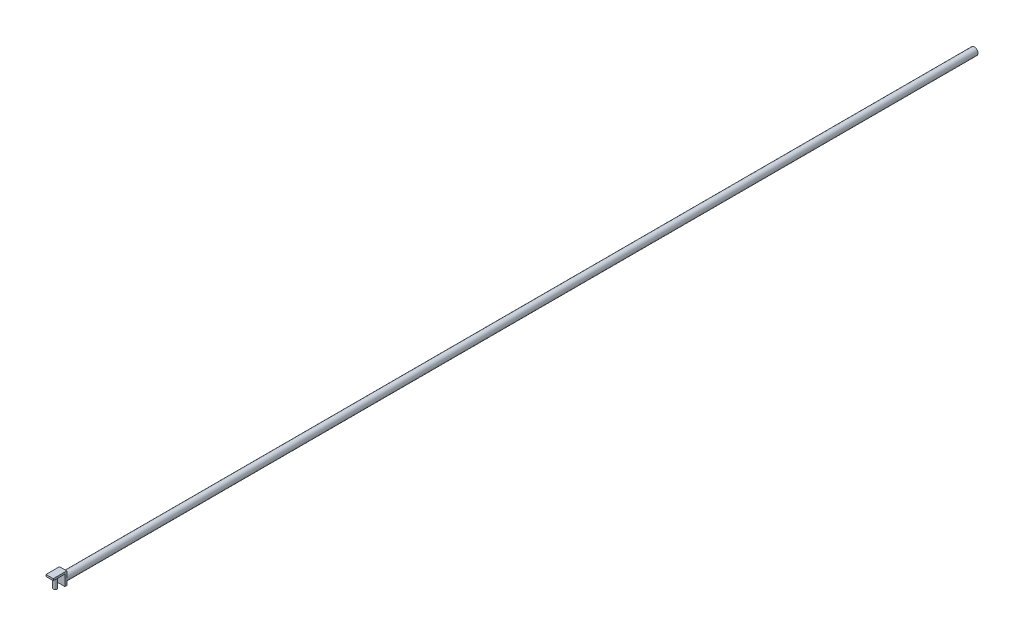
ISO-10303-21;
HEADER;
FILE_DESCRIPTION(('STEP AP214'),'2;1');
FILE_NAME('part.step','',(''),(''),'','','');
FILE_SCHEMA(('AUTOMOTIVE_DESIGN { 1 0 10303 214 1 1 1 1 }'));
ENDSEC;
DATA;
#1=APPLICATION_CONTEXT('core data for automotive mechanical design processes');
#2=APPLICATION_PROTOCOL_DEFINITION('international standard','automotive_design',2000,#1);
#3=PRODUCT_CONTEXT('',#1,'mechanical');
#4=PRODUCT('Part','Part','',(#3));
#5=PRODUCT_RELATED_PRODUCT_CATEGORY('part','',(#4));
#6=PRODUCT_DEFINITION_FORMATION('','',#4);
#7=PRODUCT_DEFINITION_CONTEXT('part definition',#1,'design');
#8=PRODUCT_DEFINITION('design','',#6,#7);
#9=PRODUCT_DEFINITION_SHAPE('','',#8);
#10=(LENGTH_UNIT() NAMED_UNIT(*) SI_UNIT(.MILLI.,.METRE.));
#11=(NAMED_UNIT(*) PLANE_ANGLE_UNIT() SI_UNIT($,.RADIAN.));
#12=(NAMED_UNIT(*) SI_UNIT($,.STERADIAN.) SOLID_ANGLE_UNIT());
#13=UNCERTAINTY_MEASURE_WITH_UNIT(LENGTH_MEASURE(1.E-05),#10,'distance_accuracy_value','');
#14=(GEOMETRIC_REPRESENTATION_CONTEXT(3) GLOBAL_UNCERTAINTY_ASSIGNED_CONTEXT((#13)) GLOBAL_UNIT_ASSIGNED_CONTEXT((#10,
#11,#12)) REPRESENTATION_CONTEXT('',''));
#15=CARTESIAN_POINT('',(0.,0.,0.));
#16=DIRECTION('',(0.,0.,1.));
#17=DIRECTION('',(1.,0.,0.));
#18=AXIS2_PLACEMENT_3D('',#15,#16,#17);
#19=CARTESIAN_POINT('',(0.,0.,0.));
#20=DIRECTION('',(0.,0.,1.));
#21=DIRECTION('',(1.,0.,0.));
#22=AXIS2_PLACEMENT_3D('',#19,#20,#21);
#23=PLANE('',#22);
#24=CARTESIAN_POINT('',(0.,0.,0.));
#25=DIRECTION('',(0.,0.,-1.));
#26=DIRECTION('',(-1.,0.,0.));
#27=AXIS2_PLACEMENT_3D('',#24,#25,#26);
#28=CIRCLE('',#27,1.);
#29=CARTESIAN_POINT('',(-1.,0.,0.));
#30=VERTEX_POINT('',#29);
#31=CARTESIAN_POINT('',(1.,0.,0.));
#32=VERTEX_POINT('',#31);
#33=EDGE_CURVE('E114',#30,#32,#28,.T.);
#34=ORIENTED_EDGE('',*,*,#33,.F.);
#35=DIRECTION('',(0.,-1.,0.));
#36=VECTOR('',#35,1.);
#37=CARTESIAN_POINT('',(-1.,1.5,0.));
#38=LINE('',#37,#36);
#39=CARTESIAN_POINT('',(-1.,2.,0.));
#40=VERTEX_POINT('',#39);
#41=EDGE_CURVE('E100',#40,#30,#38,.T.);
#42=ORIENTED_EDGE('',*,*,#41,.F.);
#43=DIRECTION('',(-1.,0.,0.));
#44=VECTOR('',#43,1.);
#45=CARTESIAN_POINT('',(-1.,2.,0.));
#46=LINE('',#45,#44);
#47=CARTESIAN_POINT('',(1.,2.,0.));
#48=VERTEX_POINT('',#47);
#49=EDGE_CURVE('E134',#48,#40,#46,.T.);
#50=ORIENTED_EDGE('',*,*,#49,.F.);
#51=DIRECTION('',(0.,1.,0.));
#52=VECTOR('',#51,1.);
#53=CARTESIAN_POINT('',(1.,1.5,0.));
#54=LINE('',#53,#52);
#55=EDGE_CURVE('E115',#32,#48,#54,.T.);
#56=ORIENTED_EDGE('',*,*,#55,.F.);
#57=EDGE_LOOP('',(#34,#42,#50,#56));
#58=FACE_BOUND('',#57,.T.);
#59=ADVANCED_FACE('F33',(#58),#23,.F.);
#60=CARTESIAN_POINT('',(-1.,1.5,0.5));
#61=DIRECTION('',(1.,0.,0.));
#62=DIRECTION('',(0.,1.,0.));
#63=AXIS2_PLACEMENT_3D('',#60,#61,#62);
#64=PLANE('',#63);
#65=ORIENTED_EDGE('',*,*,#41,.T.);
#66=CARTESIAN_POINT('',(-1.,-1.5,0.));
#67=VERTEX_POINT('',#66);
#68=EDGE_CURVE('E102',#30,#67,#38,.T.);
#69=ORIENTED_EDGE('',*,*,#68,.T.);
#70=DIRECTION('',(0.,0.,-1.));
#71=VECTOR('',#70,1.);
#72=CARTESIAN_POINT('',(-1.,-1.5,0.5));
#73=LINE('',#72,#71);
#74=CARTESIAN_POINT('',(-1.,-1.5,0.5));
#75=VERTEX_POINT('',#74);
#76=EDGE_CURVE('E122',#75,#67,#73,.T.);
#77=ORIENTED_EDGE('',*,*,#76,.F.);
#78=DIRECTION('',(0.,-1.,0.));
#79=VECTOR('',#78,1.);
#80=CARTESIAN_POINT('',(-1.,1.5,0.5));
#81=LINE('',#80,#79);
#82=CARTESIAN_POINT('',(-1.,1.5,0.5));
#83=VERTEX_POINT('',#82);
#84=EDGE_CURVE('E146',#83,#75,#81,.T.);
#85=ORIENTED_EDGE('',*,*,#84,.F.);
#86=DIRECTION('',(0.,0.,1.));
#87=VECTOR('',#86,1.);
#88=CARTESIAN_POINT('',(-1.,1.5,0.));
#89=LINE('',#88,#87);
#90=CARTESIAN_POINT('',(-1.,1.5,3.7));
#91=VERTEX_POINT('',#90);
#92=EDGE_CURVE('E56',#83,#91,#89,.T.);
#93=ORIENTED_EDGE('',*,*,#92,.T.);
#94=DIRECTION('',(0.,-1.,0.));
#95=VECTOR('',#94,1.);
#96=CARTESIAN_POINT('',(-1.,2.,3.7));
#97=LINE('',#96,#95);
#98=CARTESIAN_POINT('',(-1.,2.,3.7));
#99=VERTEX_POINT('',#98);
#100=EDGE_CURVE('E112',#99,#91,#97,.T.);
#101=ORIENTED_EDGE('',*,*,#100,.F.);
#102=DIRECTION('',(0.,0.,1.));
#103=VECTOR('',#102,1.);
#104=CARTESIAN_POINT('',(-1.,2.,0.));
#105=LINE('',#104,#103);
#106=EDGE_CURVE('E105',#40,#99,#105,.T.);
#107=ORIENTED_EDGE('',*,*,#106,.F.);
#108=EDGE_LOOP('',(#65,#69,#77,#85,#93,#101,#107));
#109=FACE_BOUND('',#108,.T.);
#110=ADVANCED_FACE('F35',(#109),#64,.F.);
#111=CARTESIAN_POINT('',(-1.,-1.5,0.5));
#112=DIRECTION('',(0.,1.,0.));
#113=DIRECTION('',(0.,0.,1.));
#114=AXIS2_PLACEMENT_3D('',#111,#112,#113);
#115=PLANE('',#114);
#116=DIRECTION('',(1.,0.,0.));
#117=VECTOR('',#116,1.);
#118=CARTESIAN_POINT('',(-1.,-1.5,0.));
#119=LINE('',#118,#117);
#120=CARTESIAN_POINT('',(1.,-1.5,0.));
#121=VERTEX_POINT('',#120);
#122=EDGE_CURVE('E72',#67,#121,#119,.T.);
#123=ORIENTED_EDGE('',*,*,#122,.T.);
#124=DIRECTION('',(0.,0.,-1.));
#125=VECTOR('',#124,1.);
#126=CARTESIAN_POINT('',(1.,-1.5,0.5));
#127=LINE('',#126,#125);
#128=CARTESIAN_POINT('',(1.,-1.5,0.5));
#129=VERTEX_POINT('',#128);
#130=EDGE_CURVE('E123',#129,#121,#127,.T.);
#131=ORIENTED_EDGE('',*,*,#130,.F.);
#132=DIRECTION('',(1.,0.,0.));
#133=VECTOR('',#132,1.);
#134=CARTESIAN_POINT('',(-1.,-1.5,0.5));
#135=LINE('',#134,#133);
#136=EDGE_CURVE('E75',#75,#129,#135,.T.);
#137=ORIENTED_EDGE('',*,*,#136,.F.);
#138=ORIENTED_EDGE('',*,*,#76,.T.);
#139=EDGE_LOOP('',(#123,#131,#137,#138));
#140=FACE_BOUND('',#139,.T.);
#141=ADVANCED_FACE('F160',(#140),#115,.F.);
#142=CARTESIAN_POINT('',(1.,1.5,0.5));
#143=DIRECTION('',(-1.,0.,0.));
#144=DIRECTION('',(0.,-1.,0.));
#145=AXIS2_PLACEMENT_3D('',#142,#143,#144);
#146=PLANE('',#145);
#147=EDGE_CURVE('E148',#121,#32,#54,.T.);
#148=ORIENTED_EDGE('',*,*,#147,.T.);
#149=ORIENTED_EDGE('',*,*,#55,.T.);
#150=DIRECTION('',(0.,0.,-1.));
#151=VECTOR('',#150,1.);
#152=CARTESIAN_POINT('',(1.,2.,0.));
#153=LINE('',#152,#151);
#154=CARTESIAN_POINT('',(1.,2.,3.7));
#155=VERTEX_POINT('',#154);
#156=EDGE_CURVE('E131',#155,#48,#153,.T.);
#157=ORIENTED_EDGE('',*,*,#156,.F.);
#158=DIRECTION('',(0.,-1.,0.));
#159=VECTOR('',#158,1.);
#160=CARTESIAN_POINT('',(1.,2.,3.7));
#161=LINE('',#160,#159);
#162=CARTESIAN_POINT('',(1.,1.5,3.7));
#163=VERTEX_POINT('',#162);
#164=EDGE_CURVE('E136',#155,#163,#161,.T.);
#165=ORIENTED_EDGE('',*,*,#164,.T.);
#166=DIRECTION('',(0.,0.,-1.));
#167=VECTOR('',#166,1.);
#168=CARTESIAN_POINT('',(1.,1.5,0.));
#169=LINE('',#168,#167);
#170=CARTESIAN_POINT('',(1.,1.5,0.5));
#171=VERTEX_POINT('',#170);
#172=EDGE_CURVE('E129',#163,#171,#169,.T.);
#173=ORIENTED_EDGE('',*,*,#172,.T.);
#174=DIRECTION('',(0.,1.,0.));
#175=VECTOR('',#174,1.);
#176=CARTESIAN_POINT('',(1.,1.5,0.5));
#177=LINE('',#176,#175);
#178=EDGE_CURVE('E150',#129,#171,#177,.T.);
#179=ORIENTED_EDGE('',*,*,#178,.F.);
#180=ORIENTED_EDGE('',*,*,#130,.T.);
#181=EDGE_LOOP('',(#148,#149,#157,#165,#173,#179,#180));
#182=FACE_BOUND('',#181,.T.);
#183=ADVANCED_FACE('F159',(#182),#146,.F.);
#184=CARTESIAN_POINT('',(0.,0.,0.5));
#185=DIRECTION('',(0.,0.,1.));
#186=DIRECTION('',(1.,0.,0.));
#187=AXIS2_PLACEMENT_3D('',#184,#185,#186);
#188=PLANE('',#187);
#189=ORIENTED_EDGE('',*,*,#84,.T.);
#190=ORIENTED_EDGE('',*,*,#136,.T.);
#191=ORIENTED_EDGE('',*,*,#178,.T.);
#192=DIRECTION('',(-1.,0.,0.));
#193=VECTOR('',#192,1.);
#194=CARTESIAN_POINT('',(-1.,1.5,0.5));
#195=LINE('',#194,#193);
#196=EDGE_CURVE('E153',#171,#83,#195,.T.);
#197=ORIENTED_EDGE('',*,*,#196,.T.);
#198=EDGE_LOOP('',(#189,#190,#191,#197));
#199=FACE_BOUND('',#198,.T.);
#200=ADVANCED_FACE('F166',(#199),#188,.T.);
#201=EDGE_CURVE('E41',#32,#30,#28,.T.);
#202=ORIENTED_EDGE('',*,*,#201,.F.);
#203=ORIENTED_EDGE('',*,*,#147,.F.);
#204=ORIENTED_EDGE('',*,*,#122,.F.);
#205=ORIENTED_EDGE('',*,*,#68,.F.);
#206=EDGE_LOOP('',(#202,#203,#204,#205));
#207=FACE_BOUND('',#206,.T.);
#208=ADVANCED_FACE('F111',(#207),#23,.F.);
#209=CARTESIAN_POINT('',(-1.,2.,3.7));
#210=DIRECTION('',(0.,0.,-1.));
#211=DIRECTION('',(-1.,0.,0.));
#212=AXIS2_PLACEMENT_3D('',#209,#210,#211);
#213=PLANE('',#212);
#214=DIRECTION('',(1.,0.,0.));
#215=VECTOR('',#214,1.);
#216=CARTESIAN_POINT('',(-1.,1.5,3.7));
#217=LINE('',#216,#215);
#218=EDGE_CURVE('E138',#91,#163,#217,.T.);
#219=ORIENTED_EDGE('',*,*,#218,.T.);
#220=ORIENTED_EDGE('',*,*,#164,.F.);
#221=DIRECTION('',(1.,0.,0.));
#222=VECTOR('',#221,1.);
#223=CARTESIAN_POINT('',(-1.,2.,3.7));
#224=LINE('',#223,#222);
#225=EDGE_CURVE('E128',#99,#155,#224,.T.);
#226=ORIENTED_EDGE('',*,*,#225,.F.);
#227=ORIENTED_EDGE('',*,*,#100,.T.);
#228=EDGE_LOOP('',(#219,#220,#226,#227));
#229=FACE_BOUND('',#228,.T.);
#230=ADVANCED_FACE('F174',(#229),#213,.F.);
#231=CARTESIAN_POINT('',(0.,2.,0.));
#232=DIRECTION('',(0.,1.,0.));
#233=DIRECTION('',(0.,0.,1.));
#234=AXIS2_PLACEMENT_3D('',#231,#232,#233);
#235=PLANE('',#234);
#236=ORIENTED_EDGE('',*,*,#106,.T.);
#237=ORIENTED_EDGE('',*,*,#225,.T.);
#238=ORIENTED_EDGE('',*,*,#156,.T.);
#239=ORIENTED_EDGE('',*,*,#49,.T.);
#240=EDGE_LOOP('',(#236,#237,#238,#239));
#241=FACE_BOUND('',#240,.T.);
#242=ADVANCED_FACE('F179',(#241),#235,.T.);
#243=CARTESIAN_POINT('',(0.,1.5,0.));
#244=DIRECTION('',(0.,1.,0.));
#245=DIRECTION('',(0.,0.,1.));
#246=AXIS2_PLACEMENT_3D('',#243,#244,#245);
#247=PLANE('',#246);
#248=CARTESIAN_POINT('',(0.,1.5,2.2));
#249=DIRECTION('',(0.,1.,0.));
#250=DIRECTION('',(0.,0.,1.));
#251=AXIS2_PLACEMENT_3D('',#248,#249,#250);
#252=CIRCLE('',#251,0.5);
#253=CARTESIAN_POINT('',(0.,1.5,2.7));
#254=VERTEX_POINT('',#253);
#255=EDGE_CURVE('E11',#254,#254,#252,.F.);
#256=ORIENTED_EDGE('',*,*,#255,.F.);
#257=EDGE_LOOP('',(#256));
#258=FACE_BOUND('',#257,.T.);
#259=ORIENTED_EDGE('',*,*,#196,.F.);
#260=ORIENTED_EDGE('',*,*,#172,.F.);
#261=ORIENTED_EDGE('',*,*,#218,.F.);
#262=ORIENTED_EDGE('',*,*,#92,.F.);
#263=EDGE_LOOP('',(#259,#260,#261,#262));
#264=FACE_BOUND('',#263,.T.);
#265=ADVANCED_FACE('F186',(#258,#264),#247,.F.);
#266=CARTESIAN_POINT('',(0.,0.,-250.));
#267=DIRECTION('',(0.,0.,1.));
#268=DIRECTION('',(1.,0.,0.));
#269=AXIS2_PLACEMENT_3D('',#266,#267,#268);
#270=CYLINDRICAL_SURFACE('',#269,1.);
#271=CARTESIAN_POINT('',(0.,0.,-250.));
#272=DIRECTION('',(0.,0.,-1.));
#273=DIRECTION('',(-1.,0.,0.));
#274=AXIS2_PLACEMENT_3D('',#271,#272,#273);
#275=CIRCLE('',#274,1.);
#276=CARTESIAN_POINT('',(-1.,0.,-250.));
#277=VERTEX_POINT('',#276);
#278=EDGE_CURVE('E118',#277,#277,#275,.T.);
#279=ORIENTED_EDGE('',*,*,#278,.F.);
#280=EDGE_LOOP('',(#279));
#281=FACE_BOUND('',#280,.T.);
#282=ORIENTED_EDGE('',*,*,#33,.T.);
#283=ORIENTED_EDGE('',*,*,#201,.T.);
#284=EDGE_LOOP('',(#282,#283));
#285=FACE_BOUND('',#284,.T.);
#286=ADVANCED_FACE('F121',(#281,#285),#270,.T.);
#287=CARTESIAN_POINT('',(0.,0.,-250.));
#288=DIRECTION('',(0.,0.,-1.));
#289=DIRECTION('',(-1.,0.,0.));
#290=AXIS2_PLACEMENT_3D('',#287,#288,#289);
#291=PLANE('',#290);
#292=ORIENTED_EDGE('',*,*,#278,.T.);
#293=EDGE_LOOP('',(#292));
#294=FACE_BOUND('',#293,.T.);
#295=ADVANCED_FACE('F195',(#294),#291,.T.);
#296=CARTESIAN_POINT('',(0.,-1.5,2.2));
#297=DIRECTION('',(0.,1.,0.));
#298=DIRECTION('',(0.,0.,1.));
#299=AXIS2_PLACEMENT_3D('',#296,#297,#298);
#300=CYLINDRICAL_SURFACE('',#299,0.5);
#301=CARTESIAN_POINT('',(0.,-1.5,2.2));
#302=DIRECTION('',(0.,-1.,0.));
#303=DIRECTION('',(0.,0.,-1.));
#304=AXIS2_PLACEMENT_3D('',#301,#302,#303);
#305=CIRCLE('',#304,0.5);
#306=CARTESIAN_POINT('',(0.,-1.5,1.7));
#307=VERTEX_POINT('',#306);
#308=EDGE_CURVE('E119',#307,#307,#305,.T.);
#309=ORIENTED_EDGE('',*,*,#308,.F.);
#310=EDGE_LOOP('',(#309));
#311=FACE_BOUND('',#310,.T.);
#312=ORIENTED_EDGE('',*,*,#255,.T.);
#313=EDGE_LOOP('',(#312));
#314=FACE_BOUND('',#313,.T.);
#315=ADVANCED_FACE('F199',(#311,#314),#300,.T.);
#316=CARTESIAN_POINT('',(0.,-1.5,2.2));
#317=DIRECTION('',(0.,-1.,0.));
#318=DIRECTION('',(0.,0.,-1.));
#319=AXIS2_PLACEMENT_3D('',#316,#317,#318);
#320=PLANE('',#319);
#321=ORIENTED_EDGE('',*,*,#308,.T.);
#322=EDGE_LOOP('',(#321));
#323=FACE_BOUND('',#322,.T.);
#324=ADVANCED_FACE('F203',(#323),#320,.T.);
#325=CLOSED_SHELL('',(#59,#110,#141,#183,#200,#208,#230,#242,#265,#286,#295,#315,#324));
#326=MANIFOLD_SOLID_BREP('B2',#325);
#327=ADVANCED_BREP_SHAPE_REPRESENTATION('',(#18,#326),#14);
#328=SHAPE_DEFINITION_REPRESENTATION(#9,#327);
ENDSEC;
END-ISO-10303-21;
